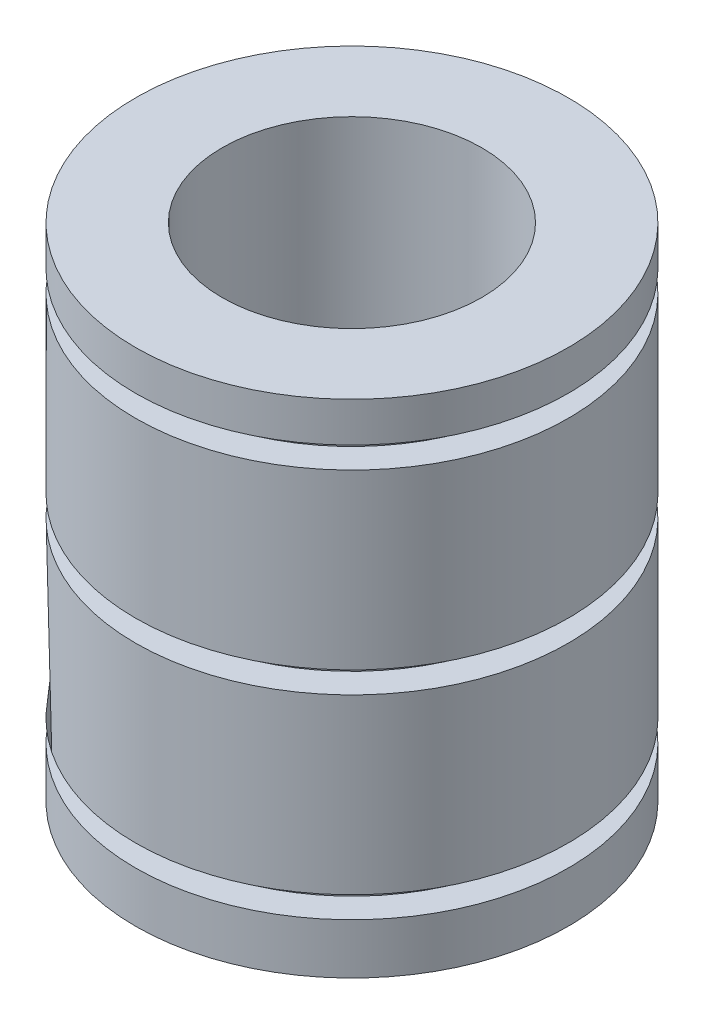
ISO-10303-21;
HEADER;
FILE_DESCRIPTION(('STEP AP214'),'2;1');
FILE_NAME('part.step','',(''),(''),'','','');
FILE_SCHEMA(('AUTOMOTIVE_DESIGN { 1 0 10303 214 1 1 1 1 }'));
ENDSEC;
DATA;
#1=APPLICATION_CONTEXT('core data for automotive mechanical design processes');
#2=APPLICATION_PROTOCOL_DEFINITION('international standard','automotive_design',2000,#1);
#3=PRODUCT_CONTEXT('',#1,'mechanical');
#4=PRODUCT('Part','Part','',(#3));
#5=PRODUCT_RELATED_PRODUCT_CATEGORY('part','',(#4));
#6=PRODUCT_DEFINITION_FORMATION('','',#4);
#7=PRODUCT_DEFINITION_CONTEXT('part definition',#1,'design');
#8=PRODUCT_DEFINITION('design','',#6,#7);
#9=PRODUCT_DEFINITION_SHAPE('','',#8);
#10=(LENGTH_UNIT() NAMED_UNIT(*) SI_UNIT(.MILLI.,.METRE.));
#11=(NAMED_UNIT(*) PLANE_ANGLE_UNIT() SI_UNIT($,.RADIAN.));
#12=(NAMED_UNIT(*) SI_UNIT($,.STERADIAN.) SOLID_ANGLE_UNIT());
#13=UNCERTAINTY_MEASURE_WITH_UNIT(LENGTH_MEASURE(1.E-05),#10,'distance_accuracy_value','');
#14=(GEOMETRIC_REPRESENTATION_CONTEXT(3) GLOBAL_UNCERTAINTY_ASSIGNED_CONTEXT((#13)) GLOBAL_UNIT_ASSIGNED_CONTEXT((#10,
#11,#12)) REPRESENTATION_CONTEXT('',''));
#15=CARTESIAN_POINT('',(0.,0.,0.));
#16=DIRECTION('',(0.,0.,1.));
#17=DIRECTION('',(1.,0.,0.));
#18=AXIS2_PLACEMENT_3D('',#15,#16,#17);
#19=CARTESIAN_POINT('',(0.,0.,0.));
#20=DIRECTION('',(0.,1.,0.));
#21=DIRECTION('',(0.,0.,1.));
#22=AXIS2_PLACEMENT_3D('',#19,#20,#21);
#23=PLANE('',#22);
#24=CARTESIAN_POINT('',(0.,0.,0.));
#25=DIRECTION('',(0.,1.,0.));
#26=DIRECTION('',(0.,0.,1.));
#27=AXIS2_PLACEMENT_3D('',#24,#25,#26);
#28=CIRCLE('',#27,9.);
#29=CARTESIAN_POINT('',(0.,0.,9.));
#30=VERTEX_POINT('',#29);
#31=EDGE_CURVE('E152',#30,#30,#28,.T.);
#32=ORIENTED_EDGE('',*,*,#31,.T.);
#33=EDGE_LOOP('',(#32));
#34=FACE_BOUND('',#33,.T.);
#35=CARTESIAN_POINT('',(0.,0.,0.));
#36=DIRECTION('',(0.,1.,0.));
#37=DIRECTION('',(0.,0.,1.));
#38=AXIS2_PLACEMENT_3D('',#35,#36,#37);
#39=CIRCLE('',#38,15.);
#40=CARTESIAN_POINT('',(0.,0.,15.));
#41=VERTEX_POINT('',#40);
#42=EDGE_CURVE('E186',#41,#41,#39,.T.);
#43=ORIENTED_EDGE('',*,*,#42,.F.);
#44=EDGE_LOOP('',(#43));
#45=FACE_BOUND('',#44,.T.);
#46=ADVANCED_FACE('F39',(#34,#45),#23,.F.);
#47=CARTESIAN_POINT('',(0.,34.75,0.));
#48=DIRECTION('',(0.,1.,0.));
#49=DIRECTION('',(0.,0.,1.));
#50=AXIS2_PLACEMENT_3D('',#47,#48,#49);
#51=PLANE('',#50);
#52=CARTESIAN_POINT('',(0.,34.75,0.));
#53=DIRECTION('',(0.,1.,0.));
#54=DIRECTION('',(0.,0.,1.));
#55=AXIS2_PLACEMENT_3D('',#52,#53,#54);
#56=CIRCLE('',#55,9.);
#57=CARTESIAN_POINT('',(0.,34.75,9.));
#58=VERTEX_POINT('',#57);
#59=EDGE_CURVE('E158',#58,#58,#56,.T.);
#60=ORIENTED_EDGE('',*,*,#59,.F.);
#61=EDGE_LOOP('',(#60));
#62=FACE_BOUND('',#61,.T.);
#63=CARTESIAN_POINT('',(0.,34.75,0.));
#64=DIRECTION('',(0.,1.,0.));
#65=DIRECTION('',(0.,0.,1.));
#66=AXIS2_PLACEMENT_3D('',#63,#64,#65);
#67=CIRCLE('',#66,15.);
#68=CARTESIAN_POINT('',(0.,34.75,15.));
#69=VERTEX_POINT('',#68);
#70=EDGE_CURVE('E151',#69,#69,#67,.T.);
#71=ORIENTED_EDGE('',*,*,#70,.T.);
#72=EDGE_LOOP('',(#71));
#73=FACE_BOUND('',#72,.T.);
#74=ADVANCED_FACE('F293',(#62,#73),#51,.T.);
#75=CARTESIAN_POINT('',(-14.,34.75,2.5));
#76=DIRECTION('',(0.,0.,-1.));
#77=DIRECTION('',(0.,1.,0.));
#78=AXIS2_PLACEMENT_3D('',#75,#76,#77);
#79=PLANE('',#78);
#80=DIRECTION('',(0.,1.,0.));
#81=VECTOR('',#80,1.);
#82=CARTESIAN_POINT('',(-14.790199457749,0.,2.5));
#83=LINE('',#82,#81);
#84=CARTESIAN_POINT('',(-14.790199457749,3.5,2.5));
#85=VERTEX_POINT('',#84);
#86=CARTESIAN_POINT('',(-14.790199457749,5.,2.5));
#87=VERTEX_POINT('',#86);
#88=EDGE_CURVE('E140',#85,#87,#83,.T.);
#89=ORIENTED_EDGE('',*,*,#88,.F.);
#90=DIRECTION('',(-1.,0.,0.));
#91=VECTOR('',#90,1.);
#92=CARTESIAN_POINT('',(0.,3.5,2.5));
#93=LINE('',#92,#91);
#94=CARTESIAN_POINT('',(-14.,3.5,2.5));
#95=VERTEX_POINT('',#94);
#96=EDGE_CURVE('E200',#95,#85,#93,.T.);
#97=ORIENTED_EDGE('',*,*,#96,.F.);
#98=DIRECTION('',(0.,-1.,0.));
#99=VECTOR('',#98,1.);
#100=CARTESIAN_POINT('',(-14.,34.75,2.5));
#101=LINE('',#100,#99);
#102=CARTESIAN_POINT('',(-14.,5.,2.5));
#103=VERTEX_POINT('',#102);
#104=EDGE_CURVE('E233',#103,#95,#101,.T.);
#105=ORIENTED_EDGE('',*,*,#104,.F.);
#106=DIRECTION('',(-1.,0.,0.));
#107=VECTOR('',#106,1.);
#108=CARTESIAN_POINT('',(0.,5.,2.5));
#109=LINE('',#108,#107);
#110=EDGE_CURVE('E268',#103,#87,#109,.T.);
#111=ORIENTED_EDGE('',*,*,#110,.T.);
#112=EDGE_LOOP('',(#89,#97,#105,#111));
#113=FACE_BOUND('',#112,.T.);
#114=ADVANCED_FACE('F296',(#113),#79,.F.);
#115=CARTESIAN_POINT('',(-14.790199457749,17.,2.5));
#116=VERTEX_POINT('',#115);
#117=CARTESIAN_POINT('',(-14.790199457749,18.5,2.5));
#118=VERTEX_POINT('',#117);
#119=EDGE_CURVE('E138',#116,#118,#83,.T.);
#120=ORIENTED_EDGE('',*,*,#119,.F.);
#121=DIRECTION('',(-1.,0.,0.));
#122=VECTOR('',#121,1.);
#123=CARTESIAN_POINT('',(0.,17.,2.5));
#124=LINE('',#123,#122);
#125=CARTESIAN_POINT('',(-14.,17.,2.5));
#126=VERTEX_POINT('',#125);
#127=EDGE_CURVE('E271',#126,#116,#124,.T.);
#128=ORIENTED_EDGE('',*,*,#127,.F.);
#129=CARTESIAN_POINT('',(-14.,18.5,2.5));
#130=VERTEX_POINT('',#129);
#131=EDGE_CURVE('E231',#130,#126,#101,.T.);
#132=ORIENTED_EDGE('',*,*,#131,.F.);
#133=DIRECTION('',(-1.,0.,0.));
#134=VECTOR('',#133,1.);
#135=CARTESIAN_POINT('',(0.,18.5,2.5));
#136=LINE('',#135,#134);
#137=EDGE_CURVE('E263',#130,#118,#136,.T.);
#138=ORIENTED_EDGE('',*,*,#137,.T.);
#139=EDGE_LOOP('',(#120,#128,#132,#138));
#140=FACE_BOUND('',#139,.T.);
#141=ADVANCED_FACE('F385',(#140),#79,.F.);
#142=CARTESIAN_POINT('',(-14.790199457749,30.5,2.5));
#143=VERTEX_POINT('',#142);
#144=CARTESIAN_POINT('',(-14.790199457749,32.,2.5));
#145=VERTEX_POINT('',#144);
#146=EDGE_CURVE('E129',#143,#145,#83,.T.);
#147=ORIENTED_EDGE('',*,*,#146,.F.);
#148=DIRECTION('',(-1.,0.,0.));
#149=VECTOR('',#148,1.);
#150=CARTESIAN_POINT('',(0.,30.5,2.5));
#151=LINE('',#150,#149);
#152=CARTESIAN_POINT('',(-14.,30.5,2.5));
#153=VERTEX_POINT('',#152);
#154=EDGE_CURVE('E266',#153,#143,#151,.T.);
#155=ORIENTED_EDGE('',*,*,#154,.F.);
#156=CARTESIAN_POINT('',(-14.,32.,2.5));
#157=VERTEX_POINT('',#156);
#158=EDGE_CURVE('E145',#157,#153,#101,.T.);
#159=ORIENTED_EDGE('',*,*,#158,.F.);
#160=DIRECTION('',(-1.,0.,0.));
#161=VECTOR('',#160,1.);
#162=CARTESIAN_POINT('',(0.,32.,2.5));
#163=LINE('',#162,#161);
#164=EDGE_CURVE('E11',#157,#145,#163,.T.);
#165=ORIENTED_EDGE('',*,*,#164,.T.);
#166=EDGE_LOOP('',(#147,#155,#159,#165));
#167=FACE_BOUND('',#166,.T.);
#168=ADVANCED_FACE('F143',(#167),#79,.F.);
#169=CARTESIAN_POINT('',(-14.,34.75,-2.5));
#170=DIRECTION('',(0.,0.,1.));
#171=DIRECTION('',(0.,-1.,0.));
#172=AXIS2_PLACEMENT_3D('',#169,#170,#171);
#173=PLANE('',#172);
#174=DIRECTION('',(0.,1.,0.));
#175=VECTOR('',#174,1.);
#176=CARTESIAN_POINT('',(-14.790199457749,0.,-2.5));
#177=LINE('',#176,#175);
#178=CARTESIAN_POINT('',(-14.790199457749,32.,-2.5));
#179=VERTEX_POINT('',#178);
#180=CARTESIAN_POINT('',(-14.790199457749,30.5,-2.5));
#181=VERTEX_POINT('',#180);
#182=EDGE_CURVE('E223',#179,#181,#177,.F.);
#183=ORIENTED_EDGE('',*,*,#182,.F.);
#184=DIRECTION('',(1.,0.,0.));
#185=VECTOR('',#184,1.);
#186=CARTESIAN_POINT('',(0.,32.,-2.5));
#187=LINE('',#186,#185);
#188=CARTESIAN_POINT('',(-14.,32.,-2.5));
#189=VERTEX_POINT('',#188);
#190=EDGE_CURVE('E46',#179,#189,#187,.T.);
#191=ORIENTED_EDGE('',*,*,#190,.T.);
#192=DIRECTION('',(0.,1.,0.));
#193=VECTOR('',#192,1.);
#194=CARTESIAN_POINT('',(-14.,34.75,-2.5));
#195=LINE('',#194,#193);
#196=CARTESIAN_POINT('',(-14.,30.5,-2.5));
#197=VERTEX_POINT('',#196);
#198=EDGE_CURVE('E221',#197,#189,#195,.T.);
#199=ORIENTED_EDGE('',*,*,#198,.F.);
#200=DIRECTION('',(1.,0.,0.));
#201=VECTOR('',#200,1.);
#202=CARTESIAN_POINT('',(0.,30.5,-2.5));
#203=LINE('',#202,#201);
#204=EDGE_CURVE('E254',#181,#197,#203,.T.);
#205=ORIENTED_EDGE('',*,*,#204,.F.);
#206=EDGE_LOOP('',(#183,#191,#199,#205));
#207=FACE_BOUND('',#206,.T.);
#208=ADVANCED_FACE('F219',(#207),#173,.F.);
#209=CARTESIAN_POINT('',(-14.790199457749,18.5,-2.5));
#210=VERTEX_POINT('',#209);
#211=CARTESIAN_POINT('',(-14.790199457749,17.,-2.5));
#212=VERTEX_POINT('',#211);
#213=EDGE_CURVE('E402',#210,#212,#177,.F.);
#214=ORIENTED_EDGE('',*,*,#213,.F.);
#215=DIRECTION('',(1.,0.,0.));
#216=VECTOR('',#215,1.);
#217=CARTESIAN_POINT('',(0.,18.5,-2.5));
#218=LINE('',#217,#216);
#219=CARTESIAN_POINT('',(-14.,18.5,-2.5));
#220=VERTEX_POINT('',#219);
#221=EDGE_CURVE('E251',#210,#220,#218,.T.);
#222=ORIENTED_EDGE('',*,*,#221,.T.);
#223=CARTESIAN_POINT('',(-14.,17.,-2.5));
#224=VERTEX_POINT('',#223);
#225=EDGE_CURVE('E228',#224,#220,#195,.T.);
#226=ORIENTED_EDGE('',*,*,#225,.F.);
#227=DIRECTION('',(1.,0.,0.));
#228=VECTOR('',#227,1.);
#229=CARTESIAN_POINT('',(0.,17.,-2.5));
#230=LINE('',#229,#228);
#231=EDGE_CURVE('E258',#212,#224,#230,.T.);
#232=ORIENTED_EDGE('',*,*,#231,.F.);
#233=EDGE_LOOP('',(#214,#222,#226,#232));
#234=FACE_BOUND('',#233,.T.);
#235=ADVANCED_FACE('F370',(#234),#173,.F.);
#236=CARTESIAN_POINT('',(-14.790199457749,5.,-2.5));
#237=VERTEX_POINT('',#236);
#238=CARTESIAN_POINT('',(-14.790199457749,3.5,-2.5));
#239=VERTEX_POINT('',#238);
#240=EDGE_CURVE('E61',#237,#239,#177,.F.);
#241=ORIENTED_EDGE('',*,*,#240,.F.);
#242=DIRECTION('',(1.,0.,0.));
#243=VECTOR('',#242,1.);
#244=CARTESIAN_POINT('',(0.,5.,-2.5));
#245=LINE('',#244,#243);
#246=CARTESIAN_POINT('',(-14.,5.,-2.5));
#247=VERTEX_POINT('',#246);
#248=EDGE_CURVE('E256',#237,#247,#245,.T.);
#249=ORIENTED_EDGE('',*,*,#248,.T.);
#250=CARTESIAN_POINT('',(-14.,3.5,-2.5));
#251=VERTEX_POINT('',#250);
#252=EDGE_CURVE('E230',#251,#247,#195,.T.);
#253=ORIENTED_EDGE('',*,*,#252,.F.);
#254=DIRECTION('',(1.,0.,0.));
#255=VECTOR('',#254,1.);
#256=CARTESIAN_POINT('',(0.,3.5,-2.5));
#257=LINE('',#256,#255);
#258=EDGE_CURVE('E261',#239,#251,#257,.T.);
#259=ORIENTED_EDGE('',*,*,#258,.F.);
#260=EDGE_LOOP('',(#241,#249,#253,#259));
#261=FACE_BOUND('',#260,.T.);
#262=ADVANCED_FACE('F365',(#261),#173,.F.);
#263=CARTESIAN_POINT('',(0.,3.5,0.));
#264=DIRECTION('',(0.,1.,0.));
#265=DIRECTION('',(0.,0.,1.));
#266=AXIS2_PLACEMENT_3D('',#263,#264,#265);
#267=PLANE('',#266);
#268=CARTESIAN_POINT('',(0.,3.5,0.));
#269=DIRECTION('',(0.,1.,0.));
#270=DIRECTION('',(0.,0.,1.));
#271=AXIS2_PLACEMENT_3D('',#268,#269,#270);
#272=CIRCLE('',#271,13.);
#273=CARTESIAN_POINT('',(0.,3.5,13.));
#274=VERTEX_POINT('',#273);
#275=EDGE_CURVE('E178',#274,#274,#272,.T.);
#276=ORIENTED_EDGE('',*,*,#275,.F.);
#277=EDGE_LOOP('',(#276));
#278=FACE_BOUND('',#277,.T.);
#279=DIRECTION('',(0.,0.,-1.));
#280=VECTOR('',#279,1.);
#281=CARTESIAN_POINT('',(-14.,3.5,0.));
#282=LINE('',#281,#280);
#283=EDGE_CURVE('E53',#95,#251,#282,.T.);
#284=ORIENTED_EDGE('',*,*,#283,.F.);
#285=ORIENTED_EDGE('',*,*,#96,.T.);
#286=CARTESIAN_POINT('',(0.,3.5,0.));
#287=DIRECTION('',(0.,1.,0.));
#288=DIRECTION('',(0.,0.,1.));
#289=AXIS2_PLACEMENT_3D('',#286,#287,#288);
#290=CIRCLE('',#289,15.);
#291=EDGE_CURVE('E189',#85,#239,#290,.T.);
#292=ORIENTED_EDGE('',*,*,#291,.T.);
#293=ORIENTED_EDGE('',*,*,#258,.T.);
#294=EDGE_LOOP('',(#284,#285,#292,#293));
#295=FACE_BOUND('',#294,.T.);
#296=ADVANCED_FACE('F357',(#278,#295),#267,.T.);
#297=CARTESIAN_POINT('',(0.,17.,0.));
#298=DIRECTION('',(0.,1.,0.));
#299=DIRECTION('',(0.,0.,1.));
#300=AXIS2_PLACEMENT_3D('',#297,#298,#299);
#301=PLANE('',#300);
#302=CARTESIAN_POINT('',(0.,17.,0.));
#303=DIRECTION('',(0.,1.,0.));
#304=DIRECTION('',(0.,0.,1.));
#305=AXIS2_PLACEMENT_3D('',#302,#303,#304);
#306=CIRCLE('',#305,13.);
#307=CARTESIAN_POINT('',(0.,17.,13.));
#308=VERTEX_POINT('',#307);
#309=EDGE_CURVE('E168',#308,#308,#306,.T.);
#310=ORIENTED_EDGE('',*,*,#309,.F.);
#311=EDGE_LOOP('',(#310));
#312=FACE_BOUND('',#311,.T.);
#313=DIRECTION('',(0.,0.,-1.));
#314=VECTOR('',#313,1.);
#315=CARTESIAN_POINT('',(-14.,17.,0.));
#316=LINE('',#315,#314);
#317=EDGE_CURVE('E248',#126,#224,#316,.T.);
#318=ORIENTED_EDGE('',*,*,#317,.F.);
#319=ORIENTED_EDGE('',*,*,#127,.T.);
#320=CARTESIAN_POINT('',(0.,17.,0.));
#321=DIRECTION('',(0.,1.,0.));
#322=DIRECTION('',(0.,0.,1.));
#323=AXIS2_PLACEMENT_3D('',#320,#321,#322);
#324=CIRCLE('',#323,15.);
#325=EDGE_CURVE('E179',#116,#212,#324,.T.);
#326=ORIENTED_EDGE('',*,*,#325,.T.);
#327=ORIENTED_EDGE('',*,*,#231,.T.);
#328=EDGE_LOOP('',(#318,#319,#326,#327));
#329=FACE_BOUND('',#328,.T.);
#330=ADVANCED_FACE('F354',(#312,#329),#301,.T.);
#331=CARTESIAN_POINT('',(0.,5.,0.));
#332=DIRECTION('',(0.,1.,0.));
#333=DIRECTION('',(0.,0.,1.));
#334=AXIS2_PLACEMENT_3D('',#331,#332,#333);
#335=PLANE('',#334);
#336=CARTESIAN_POINT('',(0.,5.,0.));
#337=DIRECTION('',(0.,1.,0.));
#338=DIRECTION('',(0.,0.,1.));
#339=AXIS2_PLACEMENT_3D('',#336,#337,#338);
#340=CIRCLE('',#339,13.);
#341=CARTESIAN_POINT('',(0.,5.,13.));
#342=VERTEX_POINT('',#341);
#343=EDGE_CURVE('E182',#342,#342,#340,.T.);
#344=ORIENTED_EDGE('',*,*,#343,.T.);
#345=EDGE_LOOP('',(#344));
#346=FACE_BOUND('',#345,.T.);
#347=ORIENTED_EDGE('',*,*,#110,.F.);
#348=DIRECTION('',(0.,0.,-1.));
#349=VECTOR('',#348,1.);
#350=CARTESIAN_POINT('',(-14.,5.,0.));
#351=LINE('',#350,#349);
#352=EDGE_CURVE('E243',#103,#247,#351,.T.);
#353=ORIENTED_EDGE('',*,*,#352,.T.);
#354=ORIENTED_EDGE('',*,*,#248,.F.);
#355=CARTESIAN_POINT('',(0.,5.,0.));
#356=DIRECTION('',(0.,1.,0.));
#357=DIRECTION('',(0.,0.,1.));
#358=AXIS2_PLACEMENT_3D('',#355,#356,#357);
#359=CIRCLE('',#358,15.);
#360=EDGE_CURVE('E175',#87,#237,#359,.T.);
#361=ORIENTED_EDGE('',*,*,#360,.F.);
#362=EDGE_LOOP('',(#347,#353,#354,#361));
#363=FACE_BOUND('',#362,.T.);
#364=ADVANCED_FACE('F346',(#346,#363),#335,.F.);
#365=CARTESIAN_POINT('',(0.,30.5,0.));
#366=DIRECTION('',(0.,1.,0.));
#367=DIRECTION('',(0.,0.,1.));
#368=AXIS2_PLACEMENT_3D('',#365,#366,#367);
#369=PLANE('',#368);
#370=CARTESIAN_POINT('',(0.,30.5,0.));
#371=DIRECTION('',(0.,1.,0.));
#372=DIRECTION('',(0.,0.,1.));
#373=AXIS2_PLACEMENT_3D('',#370,#371,#372);
#374=CIRCLE('',#373,13.);
#375=CARTESIAN_POINT('',(0.,30.5,13.));
#376=VERTEX_POINT('',#375);
#377=EDGE_CURVE('E164',#376,#376,#374,.T.);
#378=ORIENTED_EDGE('',*,*,#377,.F.);
#379=EDGE_LOOP('',(#378));
#380=FACE_BOUND('',#379,.T.);
#381=DIRECTION('',(0.,0.,-1.));
#382=VECTOR('',#381,1.);
#383=CARTESIAN_POINT('',(-14.,30.5,0.));
#384=LINE('',#383,#382);
#385=EDGE_CURVE('E227',#153,#197,#384,.T.);
#386=ORIENTED_EDGE('',*,*,#385,.F.);
#387=ORIENTED_EDGE('',*,*,#154,.T.);
#388=CARTESIAN_POINT('',(0.,30.5,0.));
#389=DIRECTION('',(0.,1.,0.));
#390=DIRECTION('',(0.,0.,1.));
#391=AXIS2_PLACEMENT_3D('',#388,#389,#390);
#392=CIRCLE('',#391,15.);
#393=EDGE_CURVE('E135',#143,#181,#392,.T.);
#394=ORIENTED_EDGE('',*,*,#393,.T.);
#395=ORIENTED_EDGE('',*,*,#204,.T.);
#396=EDGE_LOOP('',(#386,#387,#394,#395));
#397=FACE_BOUND('',#396,.T.);
#398=ADVANCED_FACE('F343',(#380,#397),#369,.T.);
#399=CARTESIAN_POINT('',(0.,18.5,0.));
#400=DIRECTION('',(0.,1.,0.));
#401=DIRECTION('',(0.,0.,1.));
#402=AXIS2_PLACEMENT_3D('',#399,#400,#401);
#403=PLANE('',#402);
#404=CARTESIAN_POINT('',(0.,18.5,0.));
#405=DIRECTION('',(0.,1.,0.));
#406=DIRECTION('',(0.,0.,1.));
#407=AXIS2_PLACEMENT_3D('',#404,#405,#406);
#408=CIRCLE('',#407,13.);
#409=CARTESIAN_POINT('',(0.,18.5,13.));
#410=VERTEX_POINT('',#409);
#411=EDGE_CURVE('E170',#410,#410,#408,.T.);
#412=ORIENTED_EDGE('',*,*,#411,.T.);
#413=EDGE_LOOP('',(#412));
#414=FACE_BOUND('',#413,.T.);
#415=ORIENTED_EDGE('',*,*,#137,.F.);
#416=DIRECTION('',(0.,0.,-1.));
#417=VECTOR('',#416,1.);
#418=CARTESIAN_POINT('',(-14.,18.5,0.));
#419=LINE('',#418,#417);
#420=EDGE_CURVE('E235',#130,#220,#419,.T.);
#421=ORIENTED_EDGE('',*,*,#420,.T.);
#422=ORIENTED_EDGE('',*,*,#221,.F.);
#423=CARTESIAN_POINT('',(0.,18.5,0.));
#424=DIRECTION('',(0.,1.,0.));
#425=DIRECTION('',(0.,0.,1.));
#426=AXIS2_PLACEMENT_3D('',#423,#424,#425);
#427=CIRCLE('',#426,15.);
#428=EDGE_CURVE('E163',#118,#210,#427,.T.);
#429=ORIENTED_EDGE('',*,*,#428,.F.);
#430=EDGE_LOOP('',(#415,#421,#422,#429));
#431=FACE_BOUND('',#430,.T.);
#432=ADVANCED_FACE('F301',(#414,#431),#403,.F.);
#433=CARTESIAN_POINT('',(0.,34.75,0.));
#434=DIRECTION('',(0.,-1.,0.));
#435=DIRECTION('',(0.,0.,-1.));
#436=AXIS2_PLACEMENT_3D('',#433,#434,#435);
#437=CYLINDRICAL_SURFACE('',#436,15.);
#438=ORIENTED_EDGE('',*,*,#291,.F.);
#439=ORIENTED_EDGE('',*,*,#88,.T.);
#440=ORIENTED_EDGE('',*,*,#360,.T.);
#441=ORIENTED_EDGE('',*,*,#240,.T.);
#442=EDGE_LOOP('',(#438,#439,#440,#441));
#443=FACE_BOUND('',#442,.T.);
#444=ORIENTED_EDGE('',*,*,#325,.F.);
#445=ORIENTED_EDGE('',*,*,#119,.T.);
#446=ORIENTED_EDGE('',*,*,#428,.T.);
#447=ORIENTED_EDGE('',*,*,#213,.T.);
#448=EDGE_LOOP('',(#444,#445,#446,#447));
#449=FACE_BOUND('',#448,.T.);
#450=ORIENTED_EDGE('',*,*,#393,.F.);
#451=ORIENTED_EDGE('',*,*,#146,.T.);
#452=CARTESIAN_POINT('',(0.,32.,0.));
#453=DIRECTION('',(0.,1.,0.));
#454=DIRECTION('',(0.,0.,1.));
#455=AXIS2_PLACEMENT_3D('',#452,#453,#454);
#456=CIRCLE('',#455,15.);
#457=EDGE_CURVE('E133',#145,#179,#456,.T.);
#458=ORIENTED_EDGE('',*,*,#457,.T.);
#459=ORIENTED_EDGE('',*,*,#182,.T.);
#460=EDGE_LOOP('',(#450,#451,#458,#459));
#461=FACE_BOUND('',#460,.T.);
#462=ORIENTED_EDGE('',*,*,#70,.F.);
#463=EDGE_LOOP('',(#462));
#464=FACE_BOUND('',#463,.T.);
#465=ORIENTED_EDGE('',*,*,#42,.T.);
#466=EDGE_LOOP('',(#465));
#467=FACE_BOUND('',#466,.T.);
#468=ADVANCED_FACE('F130',(#443,#449,#461,#464,#467),#437,.T.);
#469=CARTESIAN_POINT('',(0.,32.,0.));
#470=DIRECTION('',(0.,1.,0.));
#471=DIRECTION('',(0.,0.,1.));
#472=AXIS2_PLACEMENT_3D('',#469,#470,#471);
#473=PLANE('',#472);
#474=CARTESIAN_POINT('',(0.,32.,0.));
#475=DIRECTION('',(0.,1.,0.));
#476=DIRECTION('',(0.,0.,1.));
#477=AXIS2_PLACEMENT_3D('',#474,#475,#476);
#478=CIRCLE('',#477,13.);
#479=CARTESIAN_POINT('',(0.,32.,13.));
#480=VERTEX_POINT('',#479);
#481=EDGE_CURVE('E155',#480,#480,#478,.T.);
#482=ORIENTED_EDGE('',*,*,#481,.T.);
#483=EDGE_LOOP('',(#482));
#484=FACE_BOUND('',#483,.T.);
#485=ORIENTED_EDGE('',*,*,#164,.F.);
#486=DIRECTION('',(0.,0.,-1.));
#487=VECTOR('',#486,1.);
#488=CARTESIAN_POINT('',(-14.,32.,0.));
#489=LINE('',#488,#487);
#490=EDGE_CURVE('E195',#157,#189,#489,.T.);
#491=ORIENTED_EDGE('',*,*,#490,.T.);
#492=ORIENTED_EDGE('',*,*,#190,.F.);
#493=ORIENTED_EDGE('',*,*,#457,.F.);
#494=EDGE_LOOP('',(#485,#491,#492,#493));
#495=FACE_BOUND('',#494,.T.);
#496=ADVANCED_FACE('F149',(#484,#495),#473,.F.);
#497=CARTESIAN_POINT('',(0.,-1.2E-05,0.));
#498=DIRECTION('',(0.,1.,0.));
#499=DIRECTION('',(0.,0.,1.));
#500=AXIS2_PLACEMENT_3D('',#497,#498,#499);
#501=CYLINDRICAL_SURFACE('',#500,9.);
#502=CARTESIAN_POINT('',(0.,5.,0.));
#503=DIRECTION('',(0.,1.,0.));
#504=DIRECTION('',(0.,0.,1.));
#505=AXIS2_PLACEMENT_3D('',#502,#503,#504);
#506=CIRCLE('',#505,9.);
#507=CARTESIAN_POINT('',(0.,5.,9.));
#508=VERTEX_POINT('',#507);
#509=EDGE_CURVE('E167',#508,#508,#506,.F.);
#510=CARTESIAN_POINT('',(0.,0.,9.));
#511=CARTESIAN_POINT('',(0.,0.0520833333333333,9.));
#512=CARTESIAN_POINT('',(0.,0.104166666666667,9.));
#513=CARTESIAN_POINT('',(0.,0.208333333333333,9.));
#514=CARTESIAN_POINT('',(0.,0.260416666666667,9.));
#515=CARTESIAN_POINT('',(0.,0.364583333333333,9.));
#516=CARTESIAN_POINT('',(0.,0.416666666666667,9.));
#517=CARTESIAN_POINT('',(0.,0.520833333333333,9.));
#518=CARTESIAN_POINT('',(0.,0.572916666666667,9.));
#519=CARTESIAN_POINT('',(0.,0.677083333333333,9.));
#520=CARTESIAN_POINT('',(0.,0.729166666666667,9.));
#521=CARTESIAN_POINT('',(0.,0.833333333333333,9.));
#522=CARTESIAN_POINT('',(0.,0.885416666666667,9.));
#523=CARTESIAN_POINT('',(0.,0.989583333333333,9.));
#524=CARTESIAN_POINT('',(0.,1.04166666666667,9.));
#525=CARTESIAN_POINT('',(0.,1.14583333333333,9.));
#526=CARTESIAN_POINT('',(0.,1.19791666666667,9.));
#527=CARTESIAN_POINT('',(0.,1.30208333333333,9.));
#528=CARTESIAN_POINT('',(0.,1.35416666666667,9.));
#529=CARTESIAN_POINT('',(0.,1.45833333333333,9.));
#530=CARTESIAN_POINT('',(0.,1.51041666666667,9.));
#531=CARTESIAN_POINT('',(0.,1.61458333333333,9.));
#532=CARTESIAN_POINT('',(0.,1.66666666666667,9.));
#533=CARTESIAN_POINT('',(0.,1.77083333333333,9.));
#534=CARTESIAN_POINT('',(0.,1.82291666666667,9.));
#535=CARTESIAN_POINT('',(0.,1.92708333333333,9.));
#536=CARTESIAN_POINT('',(0.,1.97916666666667,9.));
#537=CARTESIAN_POINT('',(0.,2.08333333333333,9.));
#538=CARTESIAN_POINT('',(0.,2.13541666666667,9.));
#539=CARTESIAN_POINT('',(0.,2.23958333333333,9.));
#540=CARTESIAN_POINT('',(0.,2.29166666666667,9.));
#541=CARTESIAN_POINT('',(0.,2.39583333333333,9.));
#542=CARTESIAN_POINT('',(0.,2.44791666666667,9.));
#543=CARTESIAN_POINT('',(0.,2.55208333333333,9.));
#544=CARTESIAN_POINT('',(0.,2.60416666666667,9.));
#545=CARTESIAN_POINT('',(0.,2.70833333333333,9.));
#546=CARTESIAN_POINT('',(0.,2.76041666666667,9.));
#547=CARTESIAN_POINT('',(0.,2.86458333333333,9.));
#548=CARTESIAN_POINT('',(0.,2.91666666666667,9.));
#549=CARTESIAN_POINT('',(0.,3.02083333333333,9.));
#550=CARTESIAN_POINT('',(0.,3.07291666666667,9.));
#551=CARTESIAN_POINT('',(0.,3.17708333333333,9.));
#552=CARTESIAN_POINT('',(0.,3.22916666666667,9.));
#553=CARTESIAN_POINT('',(0.,3.33333333333333,9.));
#554=CARTESIAN_POINT('',(0.,3.38541666666667,9.));
#555=CARTESIAN_POINT('',(0.,3.48958333333333,9.));
#556=CARTESIAN_POINT('',(0.,3.54166666666667,9.));
#557=CARTESIAN_POINT('',(0.,3.64583333333333,9.));
#558=CARTESIAN_POINT('',(0.,3.69791666666667,9.));
#559=CARTESIAN_POINT('',(0.,3.80208333333333,9.));
#560=CARTESIAN_POINT('',(0.,3.85416666666667,9.));
#561=CARTESIAN_POINT('',(0.,3.95833333333333,9.));
#562=CARTESIAN_POINT('',(0.,4.01041666666667,9.));
#563=CARTESIAN_POINT('',(0.,4.11458333333333,9.));
#564=CARTESIAN_POINT('',(0.,4.16666666666667,9.));
#565=CARTESIAN_POINT('',(0.,4.27083333333333,9.));
#566=CARTESIAN_POINT('',(0.,4.32291666666667,9.));
#567=CARTESIAN_POINT('',(0.,4.42708333333333,9.));
#568=CARTESIAN_POINT('',(0.,4.47916666666667,9.));
#569=CARTESIAN_POINT('',(0.,4.58333333333333,9.));
#570=CARTESIAN_POINT('',(0.,4.63541666666667,9.));
#571=CARTESIAN_POINT('',(0.,4.73958333333333,9.));
#572=CARTESIAN_POINT('',(0.,4.79166666666667,9.));
#573=CARTESIAN_POINT('',(0.,4.89583333333333,9.));
#574=CARTESIAN_POINT('',(0.,4.94791666666667,9.));
#575=CARTESIAN_POINT('',(0.,5.,9.));
#576=B_SPLINE_CURVE_WITH_KNOTS('',3,(#510,#511,#512,#513,#514,#515,#516,#517,#518,#519,#520,
#521,#522,#523,#524,#525,#526,#527,#528,#529,#530,#531,#532,#533,#534,#535,#536,#537,#538,#539,
#540,#541,#542,#543,#544,#545,#546,#547,#548,#549,#550,#551,#552,#553,#554,#555,#556,#557,#558,
#559,#560,#561,#562,#563,#564,#565,#566,#567,#568,#569,#570,#571,#572,#573,#574,#575),
.UNSPECIFIED.,.F.,.F.,(4,2,2,2,2,2,2,2,2,2,2,2,2,2,2,2,2,2,2,2,2,2,2,2,2,2,2,2,2,2,2,2,4),(0.,
0.15625,0.3125,0.46875,0.625,0.78125,0.9375,1.09375,1.25,1.40625,1.5625,1.71875,1.875,2.03125,
2.1875,2.34375,2.5,2.65625,2.8125,2.96875,3.125,3.28125,3.4375,3.59375,3.75,3.90625,4.0625,
4.21875,4.375,4.53125,4.6875,4.84375,5.),.UNSPECIFIED.);
#577=EDGE_CURVE('BSEAM312',#30,#508,#576,.T.);
#578=ORIENTED_EDGE('',*,*,#31,.F.);
#579=ORIENTED_EDGE('',*,*,#509,.F.);
#580=ORIENTED_EDGE('',*,*,#577,.T.);
#581=ORIENTED_EDGE('',*,*,#577,.F.);
#582=EDGE_LOOP('',(#578,#580,#579,#581));
#583=FACE_BOUND('',#582,.T.);
#584=ADVANCED_FACE('F312',(#583),#501,.F.);
#585=CARTESIAN_POINT('',(0.,5.,0.));
#586=DIRECTION('',(0.,-1.,0.));
#587=DIRECTION('',(0.,0.,-1.));
#588=AXIS2_PLACEMENT_3D('',#585,#586,#587);
#589=CYLINDRICAL_SURFACE('',#588,13.);
#590=ORIENTED_EDGE('',*,*,#343,.F.);
#591=EDGE_LOOP('',(#590));
#592=FACE_BOUND('',#591,.T.);
#593=ORIENTED_EDGE('',*,*,#275,.T.);
#594=EDGE_LOOP('',(#593));
#595=FACE_BOUND('',#594,.T.);
#596=ADVANCED_FACE('F315',(#592,#595),#589,.T.);
#597=CARTESIAN_POINT('',(0.,18.5,0.));
#598=DIRECTION('',(0.,-1.,0.));
#599=DIRECTION('',(0.,0.,-1.));
#600=AXIS2_PLACEMENT_3D('',#597,#598,#599);
#601=CYLINDRICAL_SURFACE('',#600,13.);
#602=ORIENTED_EDGE('',*,*,#411,.F.);
#603=EDGE_LOOP('',(#602));
#604=FACE_BOUND('',#603,.T.);
#605=ORIENTED_EDGE('',*,*,#309,.T.);
#606=EDGE_LOOP('',(#605));
#607=FACE_BOUND('',#606,.T.);
#608=ADVANCED_FACE('F341',(#604,#607),#601,.T.);
#609=CARTESIAN_POINT('',(0.,32.,0.));
#610=DIRECTION('',(0.,-1.,0.));
#611=DIRECTION('',(0.,0.,-1.));
#612=AXIS2_PLACEMENT_3D('',#609,#610,#611);
#613=CYLINDRICAL_SURFACE('',#612,13.);
#614=ORIENTED_EDGE('',*,*,#481,.F.);
#615=EDGE_LOOP('',(#614));
#616=FACE_BOUND('',#615,.T.);
#617=ORIENTED_EDGE('',*,*,#377,.T.);
#618=EDGE_LOOP('',(#617));
#619=FACE_BOUND('',#618,.T.);
#620=ADVANCED_FACE('F331',(#616,#619),#613,.T.);
#621=CARTESIAN_POINT('',(0.,7.,0.));
#622=DIRECTION('',(0.,1.,0.));
#623=DIRECTION('',(0.,0.,1.));
#624=AXIS2_PLACEMENT_3D('',#621,#622,#623);
#625=CIRCLE('',#624,9.);
#626=CARTESIAN_POINT('',(0.,7.,9.));
#627=VERTEX_POINT('',#626);
#628=EDGE_CURVE('E285',#627,#627,#625,.T.);
#629=CARTESIAN_POINT('',(0.,7.,9.));
#630=CARTESIAN_POINT('',(0.,7.2890625,9.));
#631=CARTESIAN_POINT('',(0.,7.578125,9.));
#632=CARTESIAN_POINT('',(0.,8.15625,9.));
#633=CARTESIAN_POINT('',(0.,8.4453125,9.));
#634=CARTESIAN_POINT('',(0.,9.0234375,9.));
#635=CARTESIAN_POINT('',(0.,9.3125,9.));
#636=CARTESIAN_POINT('',(0.,9.890625,9.));
#637=CARTESIAN_POINT('',(0.,10.1796875,9.));
#638=CARTESIAN_POINT('',(0.,10.7578125,9.));
#639=CARTESIAN_POINT('',(0.,11.046875,9.));
#640=CARTESIAN_POINT('',(0.,11.625,9.));
#641=CARTESIAN_POINT('',(0.,11.9140625,9.));
#642=CARTESIAN_POINT('',(0.,12.4921875,9.));
#643=CARTESIAN_POINT('',(0.,12.78125,9.));
#644=CARTESIAN_POINT('',(0.,13.359375,9.));
#645=CARTESIAN_POINT('',(0.,13.6484375,9.));
#646=CARTESIAN_POINT('',(0.,14.2265625,9.));
#647=CARTESIAN_POINT('',(0.,14.515625,9.));
#648=CARTESIAN_POINT('',(0.,15.09375,9.));
#649=CARTESIAN_POINT('',(0.,15.3828125,9.));
#650=CARTESIAN_POINT('',(0.,15.9609375,9.));
#651=CARTESIAN_POINT('',(0.,16.25,9.));
#652=CARTESIAN_POINT('',(0.,16.828125,9.));
#653=CARTESIAN_POINT('',(0.,17.1171875,9.));
#654=CARTESIAN_POINT('',(0.,17.6953125,9.));
#655=CARTESIAN_POINT('',(0.,17.984375,9.));
#656=CARTESIAN_POINT('',(0.,18.5625,9.));
#657=CARTESIAN_POINT('',(0.,18.8515625,9.));
#658=CARTESIAN_POINT('',(0.,19.4296875,9.));
#659=CARTESIAN_POINT('',(0.,19.71875,9.));
#660=CARTESIAN_POINT('',(0.,20.296875,9.));
#661=CARTESIAN_POINT('',(0.,20.5859375,9.));
#662=CARTESIAN_POINT('',(0.,21.1640625,9.));
#663=CARTESIAN_POINT('',(0.,21.453125,9.));
#664=CARTESIAN_POINT('',(0.,22.03125,9.));
#665=CARTESIAN_POINT('',(0.,22.3203125,9.));
#666=CARTESIAN_POINT('',(0.,22.8984375,9.));
#667=CARTESIAN_POINT('',(0.,23.1875,9.));
#668=CARTESIAN_POINT('',(0.,23.765625,9.));
#669=CARTESIAN_POINT('',(0.,24.0546875,9.));
#670=CARTESIAN_POINT('',(0.,24.6328125,9.));
#671=CARTESIAN_POINT('',(0.,24.921875,9.));
#672=CARTESIAN_POINT('',(0.,25.5,9.));
#673=CARTESIAN_POINT('',(0.,25.7890625,9.));
#674=CARTESIAN_POINT('',(0.,26.3671875,9.));
#675=CARTESIAN_POINT('',(0.,26.65625,9.));
#676=CARTESIAN_POINT('',(0.,27.234375,9.));
#677=CARTESIAN_POINT('',(0.,27.5234375,9.));
#678=CARTESIAN_POINT('',(0.,28.1015625,9.));
#679=CARTESIAN_POINT('',(0.,28.390625,9.));
#680=CARTESIAN_POINT('',(0.,28.96875,9.));
#681=CARTESIAN_POINT('',(0.,29.2578125,9.));
#682=CARTESIAN_POINT('',(0.,29.8359375,9.));
#683=CARTESIAN_POINT('',(0.,30.125,9.));
#684=CARTESIAN_POINT('',(0.,30.703125,9.));
#685=CARTESIAN_POINT('',(0.,30.9921875,9.));
#686=CARTESIAN_POINT('',(0.,31.5703125,9.));
#687=CARTESIAN_POINT('',(0.,31.859375,9.));
#688=CARTESIAN_POINT('',(0.,32.4375,9.));
#689=CARTESIAN_POINT('',(0.,32.7265625,9.));
#690=CARTESIAN_POINT('',(0.,33.3046875,9.));
#691=CARTESIAN_POINT('',(0.,33.59375,9.));
#692=CARTESIAN_POINT('',(0.,34.171875,9.));
#693=CARTESIAN_POINT('',(0.,34.4609375,9.));
#694=CARTESIAN_POINT('',(0.,34.75,9.));
#695=B_SPLINE_CURVE_WITH_KNOTS('',3,(#629,#630,#631,#632,#633,#634,#635,#636,#637,#638,#639,
#640,#641,#642,#643,#644,#645,#646,#647,#648,#649,#650,#651,#652,#653,#654,#655,#656,#657,#658,
#659,#660,#661,#662,#663,#664,#665,#666,#667,#668,#669,#670,#671,#672,#673,#674,#675,#676,#677,
#678,#679,#680,#681,#682,#683,#684,#685,#686,#687,#688,#689,#690,#691,#692,#693,#694),
.UNSPECIFIED.,.F.,.F.,(4,2,2,2,2,2,2,2,2,2,2,2,2,2,2,2,2,2,2,2,2,2,2,2,2,2,2,2,2,2,2,2,4),(0.,
0.867187499999998,1.734375,2.6015625,3.46875,4.3359375,5.203125,6.0703125,6.9375,7.8046875,
8.671875,9.5390625,10.40625,11.2734375,12.140625,13.0078125,13.875,14.7421875,15.609375,
16.4765625,17.34375,18.2109375,19.078125,19.9453125,20.8125,21.6796875,22.546875,23.4140625,
24.28125,25.1484375,26.015625,26.8828125,27.75),.UNSPECIFIED.);
#696=EDGE_CURVE('BSEAM291',#627,#58,#695,.T.);
#697=ORIENTED_EDGE('',*,*,#628,.F.);
#698=ORIENTED_EDGE('',*,*,#59,.T.);
#699=ORIENTED_EDGE('',*,*,#696,.T.);
#700=ORIENTED_EDGE('',*,*,#696,.F.);
#701=EDGE_LOOP('',(#697,#699,#698,#700));
#702=FACE_BOUND('',#701,.T.);
#703=ADVANCED_FACE('F291',(#702),#501,.F.);
#704=CARTESIAN_POINT('',(0.,5.,0.));
#705=DIRECTION('',(0.,1.,0.));
#706=DIRECTION('',(0.,0.,1.));
#707=AXIS2_PLACEMENT_3D('',#704,#705,#706);
#708=PLANE('',#707);
#709=CARTESIAN_POINT('',(0.,5.,-7.));
#710=DIRECTION('',(0.,1.,0.));
#711=DIRECTION('',(0.,0.,1.));
#712=AXIS2_PLACEMENT_3D('',#709,#710,#711);
#713=CIRCLE('',#712,1.5);
#714=CARTESIAN_POINT('',(0.,5.,-5.5));
#715=VERTEX_POINT('',#714);
#716=EDGE_CURVE('E216',#715,#715,#713,.T.);
#717=ORIENTED_EDGE('',*,*,#716,.T.);
#718=EDGE_LOOP('',(#717));
#719=FACE_BOUND('',#718,.T.);
#720=CARTESIAN_POINT('',(0.,5.,7.));
#721=DIRECTION('',(0.,1.,0.));
#722=DIRECTION('',(0.,0.,1.));
#723=AXIS2_PLACEMENT_3D('',#720,#721,#722);
#724=CIRCLE('',#723,1.5);
#725=CARTESIAN_POINT('',(0.,5.,8.5));
#726=VERTEX_POINT('',#725);
#727=EDGE_CURVE('E212',#726,#726,#724,.T.);
#728=ORIENTED_EDGE('',*,*,#727,.T.);
#729=EDGE_LOOP('',(#728));
#730=FACE_BOUND('',#729,.T.);
#731=CARTESIAN_POINT('',(7.,5.,0.));
#732=DIRECTION('',(0.,1.,0.));
#733=DIRECTION('',(0.,0.,1.));
#734=AXIS2_PLACEMENT_3D('',#731,#732,#733);
#735=CIRCLE('',#734,1.5);
#736=CARTESIAN_POINT('',(7.,5.,1.5));
#737=VERTEX_POINT('',#736);
#738=EDGE_CURVE('E208',#737,#737,#735,.T.);
#739=ORIENTED_EDGE('',*,*,#738,.T.);
#740=EDGE_LOOP('',(#739));
#741=FACE_BOUND('',#740,.T.);
#742=CARTESIAN_POINT('',(-7.,5.,0.));
#743=DIRECTION('',(0.,1.,0.));
#744=DIRECTION('',(0.,0.,1.));
#745=AXIS2_PLACEMENT_3D('',#742,#743,#744);
#746=CIRCLE('',#745,1.5);
#747=CARTESIAN_POINT('',(-7.,5.,1.5));
#748=VERTEX_POINT('',#747);
#749=EDGE_CURVE('E204',#748,#748,#746,.T.);
#750=ORIENTED_EDGE('',*,*,#749,.T.);
#751=EDGE_LOOP('',(#750));
#752=FACE_BOUND('',#751,.T.);
#753=CARTESIAN_POINT('',(0.,5.,0.));
#754=DIRECTION('',(0.,1.,0.));
#755=DIRECTION('',(0.,0.,1.));
#756=AXIS2_PLACEMENT_3D('',#753,#754,#755);
#757=CIRCLE('',#756,1.5);
#758=CARTESIAN_POINT('',(0.,5.,1.5));
#759=VERTEX_POINT('',#758);
#760=EDGE_CURVE('E199',#759,#759,#757,.T.);
#761=ORIENTED_EDGE('',*,*,#760,.T.);
#762=EDGE_LOOP('',(#761));
#763=FACE_BOUND('',#762,.T.);
#764=ORIENTED_EDGE('',*,*,#509,.T.);
#765=EDGE_LOOP('',(#764));
#766=FACE_BOUND('',#765,.T.);
#767=ADVANCED_FACE('F319',(#719,#730,#741,#752,#763,#766),#708,.F.);
#768=CARTESIAN_POINT('',(0.,7.,0.));
#769=DIRECTION('',(0.,1.,0.));
#770=DIRECTION('',(0.,0.,1.));
#771=AXIS2_PLACEMENT_3D('',#768,#769,#770);
#772=PLANE('',#771);
#773=CARTESIAN_POINT('',(0.,7.,-7.));
#774=DIRECTION('',(0.,1.,0.));
#775=DIRECTION('',(0.,0.,1.));
#776=AXIS2_PLACEMENT_3D('',#773,#774,#775);
#777=CIRCLE('',#776,1.5);
#778=CARTESIAN_POINT('',(0.,7.,-5.5));
#779=VERTEX_POINT('',#778);
#780=EDGE_CURVE('E213',#779,#779,#777,.T.);
#781=ORIENTED_EDGE('',*,*,#780,.F.);
#782=EDGE_LOOP('',(#781));
#783=FACE_BOUND('',#782,.T.);
#784=CARTESIAN_POINT('',(0.,7.,7.));
#785=DIRECTION('',(0.,1.,0.));
#786=DIRECTION('',(0.,0.,1.));
#787=AXIS2_PLACEMENT_3D('',#784,#785,#786);
#788=CIRCLE('',#787,1.5);
#789=CARTESIAN_POINT('',(0.,7.,8.5));
#790=VERTEX_POINT('',#789);
#791=EDGE_CURVE('E209',#790,#790,#788,.T.);
#792=ORIENTED_EDGE('',*,*,#791,.F.);
#793=EDGE_LOOP('',(#792));
#794=FACE_BOUND('',#793,.T.);
#795=CARTESIAN_POINT('',(7.,7.,0.));
#796=DIRECTION('',(0.,1.,0.));
#797=DIRECTION('',(0.,0.,1.));
#798=AXIS2_PLACEMENT_3D('',#795,#796,#797);
#799=CIRCLE('',#798,1.5);
#800=CARTESIAN_POINT('',(7.,7.,1.5));
#801=VERTEX_POINT('',#800);
#802=EDGE_CURVE('E205',#801,#801,#799,.T.);
#803=ORIENTED_EDGE('',*,*,#802,.F.);
#804=EDGE_LOOP('',(#803));
#805=FACE_BOUND('',#804,.T.);
#806=CARTESIAN_POINT('',(-7.,7.,0.));
#807=DIRECTION('',(0.,1.,0.));
#808=DIRECTION('',(0.,0.,1.));
#809=AXIS2_PLACEMENT_3D('',#806,#807,#808);
#810=CIRCLE('',#809,1.5);
#811=CARTESIAN_POINT('',(-7.,7.,1.5));
#812=VERTEX_POINT('',#811);
#813=EDGE_CURVE('E201',#812,#812,#810,.T.);
#814=ORIENTED_EDGE('',*,*,#813,.F.);
#815=EDGE_LOOP('',(#814));
#816=FACE_BOUND('',#815,.T.);
#817=CARTESIAN_POINT('',(0.,7.,0.));
#818=DIRECTION('',(0.,1.,0.));
#819=DIRECTION('',(0.,0.,1.));
#820=AXIS2_PLACEMENT_3D('',#817,#818,#819);
#821=CIRCLE('',#820,1.5);
#822=CARTESIAN_POINT('',(0.,7.,1.5));
#823=VERTEX_POINT('',#822);
#824=EDGE_CURVE('E196',#823,#823,#821,.T.);
#825=ORIENTED_EDGE('',*,*,#824,.F.);
#826=EDGE_LOOP('',(#825));
#827=FACE_BOUND('',#826,.T.);
#828=ORIENTED_EDGE('',*,*,#628,.T.);
#829=EDGE_LOOP('',(#828));
#830=FACE_BOUND('',#829,.T.);
#831=ADVANCED_FACE('F321',(#783,#794,#805,#816,#827,#830),#772,.T.);
#832=CARTESIAN_POINT('',(0.,0.,0.));
#833=DIRECTION('',(0.,1.,0.));
#834=DIRECTION('',(0.,0.,1.));
#835=AXIS2_PLACEMENT_3D('',#832,#833,#834);
#836=CYLINDRICAL_SURFACE('',#835,1.5);
#837=ORIENTED_EDGE('',*,*,#824,.T.);
#838=EDGE_LOOP('',(#837));
#839=FACE_BOUND('',#838,.T.);
#840=ORIENTED_EDGE('',*,*,#760,.F.);
#841=EDGE_LOOP('',(#840));
#842=FACE_BOUND('',#841,.T.);
#843=ADVANCED_FACE('F328',(#839,#842),#836,.F.);
#844=CARTESIAN_POINT('',(-7.,0.,0.));
#845=DIRECTION('',(0.,1.,0.));
#846=DIRECTION('',(0.,0.,1.));
#847=AXIS2_PLACEMENT_3D('',#844,#845,#846);
#848=CYLINDRICAL_SURFACE('',#847,1.5);
#849=ORIENTED_EDGE('',*,*,#813,.T.);
#850=EDGE_LOOP('',(#849));
#851=FACE_BOUND('',#850,.T.);
#852=ORIENTED_EDGE('',*,*,#749,.F.);
#853=EDGE_LOOP('',(#852));
#854=FACE_BOUND('',#853,.T.);
#855=ADVANCED_FACE('F501',(#851,#854),#848,.F.);
#856=CARTESIAN_POINT('',(7.,0.,0.));
#857=DIRECTION('',(0.,1.,0.));
#858=DIRECTION('',(0.,0.,1.));
#859=AXIS2_PLACEMENT_3D('',#856,#857,#858);
#860=CYLINDRICAL_SURFACE('',#859,1.5);
#861=ORIENTED_EDGE('',*,*,#802,.T.);
#862=EDGE_LOOP('',(#861));
#863=FACE_BOUND('',#862,.T.);
#864=ORIENTED_EDGE('',*,*,#738,.F.);
#865=EDGE_LOOP('',(#864));
#866=FACE_BOUND('',#865,.T.);
#867=ADVANCED_FACE('F491',(#863,#866),#860,.F.);
#868=CARTESIAN_POINT('',(0.,0.,7.));
#869=DIRECTION('',(0.,1.,0.));
#870=DIRECTION('',(0.,0.,1.));
#871=AXIS2_PLACEMENT_3D('',#868,#869,#870);
#872=CYLINDRICAL_SURFACE('',#871,1.5);
#873=ORIENTED_EDGE('',*,*,#791,.T.);
#874=EDGE_LOOP('',(#873));
#875=FACE_BOUND('',#874,.T.);
#876=ORIENTED_EDGE('',*,*,#727,.F.);
#877=EDGE_LOOP('',(#876));
#878=FACE_BOUND('',#877,.T.);
#879=ADVANCED_FACE('F422',(#875,#878),#872,.F.);
#880=CARTESIAN_POINT('',(0.,0.,-7.));
#881=DIRECTION('',(0.,1.,0.));
#882=DIRECTION('',(0.,0.,1.));
#883=AXIS2_PLACEMENT_3D('',#880,#881,#882);
#884=CYLINDRICAL_SURFACE('',#883,1.5);
#885=ORIENTED_EDGE('',*,*,#780,.T.);
#886=EDGE_LOOP('',(#885));
#887=FACE_BOUND('',#886,.T.);
#888=ORIENTED_EDGE('',*,*,#716,.F.);
#889=EDGE_LOOP('',(#888));
#890=FACE_BOUND('',#889,.T.);
#891=ADVANCED_FACE('F417',(#887,#890),#884,.F.);
#892=CARTESIAN_POINT('',(-14.,0.,0.));
#893=DIRECTION('',(1.,0.,0.));
#894=DIRECTION('',(0.,0.,-1.));
#895=AXIS2_PLACEMENT_3D('',#892,#893,#894);
#896=PLANE('',#895);
#897=ORIENTED_EDGE('',*,*,#104,.T.);
#898=ORIENTED_EDGE('',*,*,#283,.T.);
#899=ORIENTED_EDGE('',*,*,#252,.T.);
#900=ORIENTED_EDGE('',*,*,#352,.F.);
#901=EDGE_LOOP('',(#897,#898,#899,#900));
#902=FACE_BOUND('',#901,.T.);
#903=ADVANCED_FACE('F413',(#902),#896,.T.);
#904=ORIENTED_EDGE('',*,*,#131,.T.);
#905=ORIENTED_EDGE('',*,*,#317,.T.);
#906=ORIENTED_EDGE('',*,*,#225,.T.);
#907=ORIENTED_EDGE('',*,*,#420,.F.);
#908=EDGE_LOOP('',(#904,#905,#906,#907));
#909=FACE_BOUND('',#908,.T.);
#910=ADVANCED_FACE('F409',(#909),#896,.T.);
#911=ORIENTED_EDGE('',*,*,#158,.T.);
#912=ORIENTED_EDGE('',*,*,#385,.T.);
#913=ORIENTED_EDGE('',*,*,#198,.T.);
#914=ORIENTED_EDGE('',*,*,#490,.F.);
#915=EDGE_LOOP('',(#911,#912,#913,#914));
#916=FACE_BOUND('',#915,.T.);
#917=ADVANCED_FACE('F225',(#916),#896,.T.);
#918=CLOSED_SHELL('',(#46,#74,#114,#141,#168,#208,#235,#262,#296,#330,#364,#398,#432,#468,#496,
#584,#596,#608,#620,#703,#767,#831,#843,#855,#867,#879,#891,#903,#910,#917));
#919=MANIFOLD_SOLID_BREP('B2',#918);
#920=ADVANCED_BREP_SHAPE_REPRESENTATION('',(#18,#919),#14);
#921=SHAPE_DEFINITION_REPRESENTATION(#9,#920);
ENDSEC;
END-ISO-10303-21;
